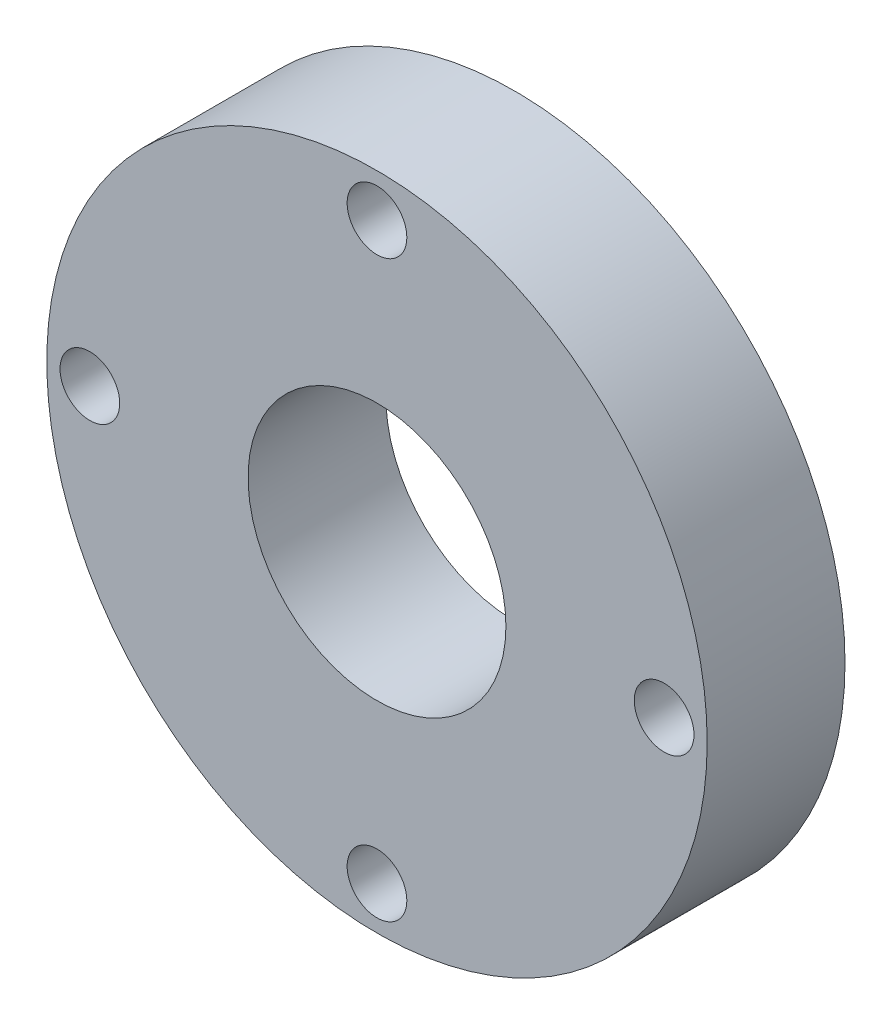
ISO-10303-21;
HEADER;
FILE_DESCRIPTION(('STEP AP214'),'2;1');
FILE_NAME('part.step','',(''),(''),'','','');
FILE_SCHEMA(('AUTOMOTIVE_DESIGN { 1 0 10303 214 1 1 1 1 }'));
ENDSEC;
DATA;
#1=APPLICATION_CONTEXT('core data for automotive mechanical design processes');
#2=APPLICATION_PROTOCOL_DEFINITION('international standard','automotive_design',2000,#1);
#3=PRODUCT_CONTEXT('',#1,'mechanical');
#4=PRODUCT('Part','Part','',(#3));
#5=PRODUCT_RELATED_PRODUCT_CATEGORY('part','',(#4));
#6=PRODUCT_DEFINITION_FORMATION('','',#4);
#7=PRODUCT_DEFINITION_CONTEXT('part definition',#1,'design');
#8=PRODUCT_DEFINITION('design','',#6,#7);
#9=PRODUCT_DEFINITION_SHAPE('','',#8);
#10=(LENGTH_UNIT() NAMED_UNIT(*) SI_UNIT(.MILLI.,.METRE.));
#11=(NAMED_UNIT(*) PLANE_ANGLE_UNIT() SI_UNIT($,.RADIAN.));
#12=(NAMED_UNIT(*) SI_UNIT($,.STERADIAN.) SOLID_ANGLE_UNIT());
#13=UNCERTAINTY_MEASURE_WITH_UNIT(LENGTH_MEASURE(1.E-05),#10,'distance_accuracy_value','');
#14=(GEOMETRIC_REPRESENTATION_CONTEXT(3) GLOBAL_UNCERTAINTY_ASSIGNED_CONTEXT((#13)) GLOBAL_UNIT_ASSIGNED_CONTEXT((#10,
#11,#12)) REPRESENTATION_CONTEXT('',''));
#15=CARTESIAN_POINT('',(0.,0.,0.));
#16=DIRECTION('',(0.,0.,1.));
#17=DIRECTION('',(1.,0.,0.));
#18=AXIS2_PLACEMENT_3D('',#15,#16,#17);
#19=CARTESIAN_POINT('',(0.,0.,1000.));
#20=DIRECTION('',(0.,0.,1.));
#21=DIRECTION('',(1.,0.,0.));
#22=AXIS2_PLACEMENT_3D('',#19,#20,#21);
#23=CYLINDRICAL_SURFACE('',#22,36.5125);
#24=CARTESIAN_POINT('',(0.,0.,134.709000076));
#25=DIRECTION('',(0.,0.,1.));
#26=DIRECTION('',(1.,0.,0.));
#27=AXIS2_PLACEMENT_3D('',#24,#25,#26);
#28=CIRCLE('',#27,36.5125);
#29=CARTESIAN_POINT('',(36.5125,0.,134.709000076));
#30=VERTEX_POINT('',#29);
#31=EDGE_CURVE('E10',#30,#30,#28,.T.);
#32=ORIENTED_EDGE('',*,*,#31,.F.);
#33=EDGE_LOOP('',(#32));
#34=FACE_BOUND('',#33,.T.);
#35=CARTESIAN_POINT('',(0.,0.,119.469000076));
#36=DIRECTION('',(0.,0.,1.));
#37=DIRECTION('',(1.,0.,0.));
#38=AXIS2_PLACEMENT_3D('',#35,#36,#37);
#39=CIRCLE('',#38,36.5125);
#40=CARTESIAN_POINT('',(36.5125,0.,119.469000076));
#41=VERTEX_POINT('',#40);
#42=EDGE_CURVE('E44',#41,#41,#39,.T.);
#43=ORIENTED_EDGE('',*,*,#42,.T.);
#44=EDGE_LOOP('',(#43));
#45=FACE_BOUND('',#44,.T.);
#46=ADVANCED_FACE('F37',(#34,#45),#23,.T.);
#47=CARTESIAN_POINT('',(0.,0.,134.709000076));
#48=DIRECTION('',(0.,0.,-1.));
#49=DIRECTION('',(-1.,0.,0.));
#50=AXIS2_PLACEMENT_3D('',#47,#48,#49);
#51=PLANE('',#50);
#52=CARTESIAN_POINT('',(-31.75,3.32563597524808E-13,134.709000076));
#53=DIRECTION('',(0.,0.,1.));
#54=DIRECTION('',(1.,0.,0.));
#55=AXIS2_PLACEMENT_3D('',#52,#53,#54);
#56=CIRCLE('',#55,3.3);
#57=CARTESIAN_POINT('',(-28.45,3.32563597524808E-13,134.709000076));
#58=VERTEX_POINT('',#57);
#59=EDGE_CURVE('E81',#58,#58,#56,.T.);
#60=ORIENTED_EDGE('',*,*,#59,.F.);
#61=EDGE_LOOP('',(#60));
#62=FACE_BOUND('',#61,.T.);
#63=CARTESIAN_POINT('',(0.,-31.75,134.709000076));
#64=DIRECTION('',(0.,0.,1.));
#65=DIRECTION('',(1.,0.,0.));
#66=AXIS2_PLACEMENT_3D('',#63,#64,#65);
#67=CIRCLE('',#66,3.3);
#68=CARTESIAN_POINT('',(3.3,-31.75,134.709000076));
#69=VERTEX_POINT('',#68);
#70=EDGE_CURVE('E75',#69,#69,#67,.T.);
#71=ORIENTED_EDGE('',*,*,#70,.F.);
#72=EDGE_LOOP('',(#71));
#73=FACE_BOUND('',#72,.T.);
#74=CARTESIAN_POINT('',(31.75,-1.10854532508269E-13,134.709000076));
#75=DIRECTION('',(0.,0.,1.));
#76=DIRECTION('',(1.,0.,0.));
#77=AXIS2_PLACEMENT_3D('',#74,#75,#76);
#78=CIRCLE('',#77,3.3);
#79=CARTESIAN_POINT('',(35.05,-1.10854532508269E-13,134.709000076));
#80=VERTEX_POINT('',#79);
#81=EDGE_CURVE('E69',#80,#80,#78,.T.);
#82=ORIENTED_EDGE('',*,*,#81,.F.);
#83=EDGE_LOOP('',(#82));
#84=FACE_BOUND('',#83,.T.);
#85=CARTESIAN_POINT('',(0.,31.75,134.709000076));
#86=DIRECTION('',(0.,0.,1.));
#87=DIRECTION('',(1.,0.,0.));
#88=AXIS2_PLACEMENT_3D('',#85,#86,#87);
#89=CIRCLE('',#88,3.3);
#90=CARTESIAN_POINT('',(3.3,31.75,134.709000076));
#91=VERTEX_POINT('',#90);
#92=EDGE_CURVE('E63',#91,#91,#89,.T.);
#93=ORIENTED_EDGE('',*,*,#92,.F.);
#94=EDGE_LOOP('',(#93));
#95=FACE_BOUND('',#94,.T.);
#96=CARTESIAN_POINT('',(0.,0.,134.709000076));
#97=DIRECTION('',(0.,0.,1.));
#98=DIRECTION('',(1.,0.,0.));
#99=AXIS2_PLACEMENT_3D('',#96,#97,#98);
#100=CIRCLE('',#99,14.25575);
#101=CARTESIAN_POINT('',(14.25575,0.,134.709000076));
#102=VERTEX_POINT('',#101);
#103=EDGE_CURVE('E55',#102,#102,#100,.T.);
#104=ORIENTED_EDGE('',*,*,#103,.F.);
#105=EDGE_LOOP('',(#104));
#106=FACE_BOUND('',#105,.T.);
#107=ORIENTED_EDGE('',*,*,#31,.T.);
#108=EDGE_LOOP('',(#107));
#109=FACE_BOUND('',#108,.T.);
#110=ADVANCED_FACE('F87',(#62,#73,#84,#95,#106,#109),#51,.F.);
#111=CARTESIAN_POINT('',(0.,0.,119.469000076));
#112=DIRECTION('',(0.,0.,-1.));
#113=DIRECTION('',(-1.,0.,0.));
#114=AXIS2_PLACEMENT_3D('',#111,#112,#113);
#115=PLANE('',#114);
#116=CARTESIAN_POINT('',(-31.75,3.32563597524808E-13,119.469000076));
#117=DIRECTION('',(0.,0.,1.));
#118=DIRECTION('',(1.,0.,0.));
#119=AXIS2_PLACEMENT_3D('',#116,#117,#118);
#120=CIRCLE('',#119,3.3);
#121=CARTESIAN_POINT('',(-28.45,3.32563597524808E-13,119.469000076));
#122=VERTEX_POINT('',#121);
#123=EDGE_CURVE('E78',#122,#122,#120,.T.);
#124=ORIENTED_EDGE('',*,*,#123,.T.);
#125=EDGE_LOOP('',(#124));
#126=FACE_BOUND('',#125,.T.);
#127=CARTESIAN_POINT('',(0.,-31.75,119.469000076));
#128=DIRECTION('',(0.,0.,1.));
#129=DIRECTION('',(1.,0.,0.));
#130=AXIS2_PLACEMENT_3D('',#127,#128,#129);
#131=CIRCLE('',#130,3.3);
#132=CARTESIAN_POINT('',(3.3,-31.75,119.469000076));
#133=VERTEX_POINT('',#132);
#134=EDGE_CURVE('E72',#133,#133,#131,.T.);
#135=ORIENTED_EDGE('',*,*,#134,.T.);
#136=EDGE_LOOP('',(#135));
#137=FACE_BOUND('',#136,.T.);
#138=CARTESIAN_POINT('',(31.75,-1.10854532508269E-13,119.469000076));
#139=DIRECTION('',(0.,0.,1.));
#140=DIRECTION('',(1.,0.,0.));
#141=AXIS2_PLACEMENT_3D('',#138,#139,#140);
#142=CIRCLE('',#141,3.3);
#143=CARTESIAN_POINT('',(35.05,-1.10854532508269E-13,119.469000076));
#144=VERTEX_POINT('',#143);
#145=EDGE_CURVE('E66',#144,#144,#142,.T.);
#146=ORIENTED_EDGE('',*,*,#145,.T.);
#147=EDGE_LOOP('',(#146));
#148=FACE_BOUND('',#147,.T.);
#149=CARTESIAN_POINT('',(0.,31.75,119.469000076));
#150=DIRECTION('',(0.,0.,1.));
#151=DIRECTION('',(1.,0.,0.));
#152=AXIS2_PLACEMENT_3D('',#149,#150,#151);
#153=CIRCLE('',#152,3.3);
#154=CARTESIAN_POINT('',(3.3,31.75,119.469000076));
#155=VERTEX_POINT('',#154);
#156=EDGE_CURVE('E59',#155,#155,#153,.T.);
#157=ORIENTED_EDGE('',*,*,#156,.T.);
#158=EDGE_LOOP('',(#157));
#159=FACE_BOUND('',#158,.T.);
#160=CARTESIAN_POINT('',(0.,0.,119.469000076));
#161=DIRECTION('',(0.,0.,1.));
#162=DIRECTION('',(1.,0.,0.));
#163=AXIS2_PLACEMENT_3D('',#160,#161,#162);
#164=CIRCLE('',#163,14.25575);
#165=CARTESIAN_POINT('',(14.25575,0.,119.469000076));
#166=VERTEX_POINT('',#165);
#167=EDGE_CURVE('E51',#166,#166,#164,.T.);
#168=ORIENTED_EDGE('',*,*,#167,.T.);
#169=EDGE_LOOP('',(#168));
#170=FACE_BOUND('',#169,.T.);
#171=ORIENTED_EDGE('',*,*,#42,.F.);
#172=EDGE_LOOP('',(#171));
#173=FACE_BOUND('',#172,.T.);
#174=ADVANCED_FACE('F90',(#126,#137,#148,#159,#170,#173),#115,.T.);
#175=CARTESIAN_POINT('',(0.,0.,119.469000076));
#176=DIRECTION('',(0.,0.,1.));
#177=DIRECTION('',(1.,0.,0.));
#178=AXIS2_PLACEMENT_3D('',#175,#176,#177);
#179=CYLINDRICAL_SURFACE('',#178,14.25575);
#180=ORIENTED_EDGE('',*,*,#167,.F.);
#181=EDGE_LOOP('',(#180));
#182=FACE_BOUND('',#181,.T.);
#183=ORIENTED_EDGE('',*,*,#103,.T.);
#184=EDGE_LOOP('',(#183));
#185=FACE_BOUND('',#184,.T.);
#186=ADVANCED_FACE('F99',(#182,#185),#179,.F.);
#187=CARTESIAN_POINT('',(0.,31.75,134.709000076));
#188=DIRECTION('',(0.,0.,1.));
#189=DIRECTION('',(1.,0.,0.));
#190=AXIS2_PLACEMENT_3D('',#187,#188,#189);
#191=CYLINDRICAL_SURFACE('',#190,3.3);
#192=ORIENTED_EDGE('',*,*,#156,.F.);
#193=EDGE_LOOP('',(#192));
#194=FACE_BOUND('',#193,.T.);
#195=ORIENTED_EDGE('',*,*,#92,.T.);
#196=EDGE_LOOP('',(#195));
#197=FACE_BOUND('',#196,.T.);
#198=ADVANCED_FACE('F101',(#194,#197),#191,.F.);
#199=CARTESIAN_POINT('',(31.75,-1.10854532508269E-13,134.709000076));
#200=DIRECTION('',(0.,0.,1.));
#201=DIRECTION('',(1.,0.,0.));
#202=AXIS2_PLACEMENT_3D('',#199,#200,#201);
#203=CYLINDRICAL_SURFACE('',#202,3.3);
#204=ORIENTED_EDGE('',*,*,#145,.F.);
#205=EDGE_LOOP('',(#204));
#206=FACE_BOUND('',#205,.T.);
#207=ORIENTED_EDGE('',*,*,#81,.T.);
#208=EDGE_LOOP('',(#207));
#209=FACE_BOUND('',#208,.T.);
#210=ADVANCED_FACE('F108',(#206,#209),#203,.F.);
#211=CARTESIAN_POINT('',(0.,-31.75,134.709000076));
#212=DIRECTION('',(0.,0.,1.));
#213=DIRECTION('',(1.,0.,0.));
#214=AXIS2_PLACEMENT_3D('',#211,#212,#213);
#215=CYLINDRICAL_SURFACE('',#214,3.3);
#216=ORIENTED_EDGE('',*,*,#134,.F.);
#217=EDGE_LOOP('',(#216));
#218=FACE_BOUND('',#217,.T.);
#219=ORIENTED_EDGE('',*,*,#70,.T.);
#220=EDGE_LOOP('',(#219));
#221=FACE_BOUND('',#220,.T.);
#222=ADVANCED_FACE('F140',(#218,#221),#215,.F.);
#223=CARTESIAN_POINT('',(-31.75,3.32563597524808E-13,134.709000076));
#224=DIRECTION('',(0.,0.,1.));
#225=DIRECTION('',(1.,0.,0.));
#226=AXIS2_PLACEMENT_3D('',#223,#224,#225);
#227=CYLINDRICAL_SURFACE('',#226,3.3);
#228=ORIENTED_EDGE('',*,*,#123,.F.);
#229=EDGE_LOOP('',(#228));
#230=FACE_BOUND('',#229,.T.);
#231=ORIENTED_EDGE('',*,*,#59,.T.);
#232=EDGE_LOOP('',(#231));
#233=FACE_BOUND('',#232,.T.);
#234=ADVANCED_FACE('F85',(#230,#233),#227,.F.);
#235=CLOSED_SHELL('',(#46,#110,#174,#186,#198,#210,#222,#234));
#236=MANIFOLD_SOLID_BREP('B2',#235);
#237=ADVANCED_BREP_SHAPE_REPRESENTATION('',(#18,#236),#14);
#238=SHAPE_DEFINITION_REPRESENTATION(#9,#237);
ENDSEC;
END-ISO-10303-21;
